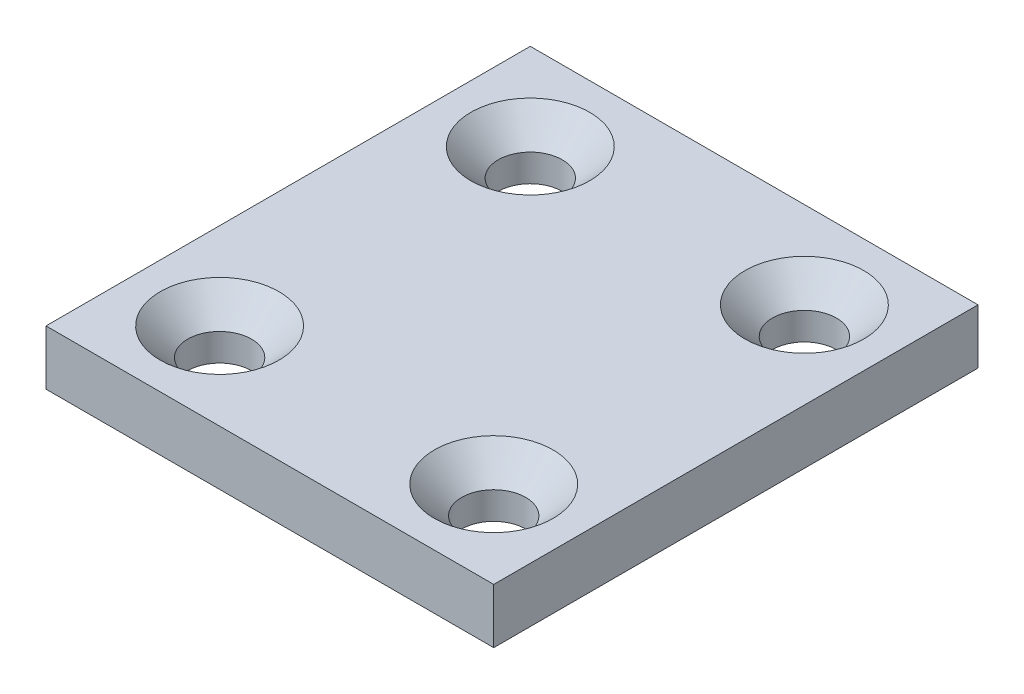
ISO-10303-21;
HEADER;
FILE_DESCRIPTION(('STEP AP214'),'2;1');
FILE_NAME('part.step','',(''),(''),'','','');
FILE_SCHEMA(('AUTOMOTIVE_DESIGN { 1 0 10303 214 1 1 1 1 }'));
ENDSEC;
DATA;
#1=APPLICATION_CONTEXT('core data for automotive mechanical design processes');
#2=APPLICATION_PROTOCOL_DEFINITION('international standard','automotive_design',2000,#1);
#3=PRODUCT_CONTEXT('',#1,'mechanical');
#4=PRODUCT('Part','Part','',(#3));
#5=PRODUCT_RELATED_PRODUCT_CATEGORY('part','',(#4));
#6=PRODUCT_DEFINITION_FORMATION('','',#4);
#7=PRODUCT_DEFINITION_CONTEXT('part definition',#1,'design');
#8=PRODUCT_DEFINITION('design','',#6,#7);
#9=PRODUCT_DEFINITION_SHAPE('','',#8);
#10=(LENGTH_UNIT() NAMED_UNIT(*) SI_UNIT(.MILLI.,.METRE.));
#11=(NAMED_UNIT(*) PLANE_ANGLE_UNIT() SI_UNIT($,.RADIAN.));
#12=(NAMED_UNIT(*) SI_UNIT($,.STERADIAN.) SOLID_ANGLE_UNIT());
#13=UNCERTAINTY_MEASURE_WITH_UNIT(LENGTH_MEASURE(1.E-05),#10,'distance_accuracy_value','');
#14=(GEOMETRIC_REPRESENTATION_CONTEXT(3) GLOBAL_UNCERTAINTY_ASSIGNED_CONTEXT((#13)) GLOBAL_UNIT_ASSIGNED_CONTEXT((#10,
#11,#12)) REPRESENTATION_CONTEXT('',''));
#15=CARTESIAN_POINT('',(0.,0.,0.));
#16=DIRECTION('',(0.,0.,1.));
#17=DIRECTION('',(1.,0.,0.));
#18=AXIS2_PLACEMENT_3D('',#15,#16,#17);
#19=CARTESIAN_POINT('',(0.,3.,0.));
#20=DIRECTION('',(0.,-1.,0.));
#21=DIRECTION('',(0.,0.,-1.));
#22=AXIS2_PLACEMENT_3D('',#19,#20,#21);
#23=PLANE('',#22);
#24=CARTESIAN_POINT('',(0.,3.,0.));
#25=DIRECTION('',(0.,1.,0.));
#26=DIRECTION('',(0.,0.,1.));
#27=AXIS2_PLACEMENT_3D('',#24,#25,#26);
#28=CIRCLE('',#27,3.25);
#29=CARTESIAN_POINT('',(0.,3.,3.25));
#30=VERTEX_POINT('',#29);
#31=EDGE_CURVE('E154',#30,#30,#28,.T.);
#32=ORIENTED_EDGE('',*,*,#31,.F.);
#33=EDGE_LOOP('',(#32));
#34=FACE_BOUND('',#33,.T.);
#35=CARTESIAN_POINT('',(15.,3.,0.));
#36=DIRECTION('',(0.,1.,0.));
#37=DIRECTION('',(0.,0.,1.));
#38=AXIS2_PLACEMENT_3D('',#35,#36,#37);
#39=CIRCLE('',#38,3.25);
#40=CARTESIAN_POINT('',(15.,3.,3.25));
#41=VERTEX_POINT('',#40);
#42=EDGE_CURVE('E143',#41,#41,#39,.T.);
#43=ORIENTED_EDGE('',*,*,#42,.F.);
#44=EDGE_LOOP('',(#43));
#45=FACE_BOUND('',#44,.T.);
#46=CARTESIAN_POINT('',(0.,3.,-17.));
#47=DIRECTION('',(0.,1.,0.));
#48=DIRECTION('',(0.,0.,1.));
#49=AXIS2_PLACEMENT_3D('',#46,#47,#48);
#50=CIRCLE('',#49,3.25);
#51=CARTESIAN_POINT('',(0.,3.,-13.75));
#52=VERTEX_POINT('',#51);
#53=EDGE_CURVE('E136',#52,#52,#50,.T.);
#54=ORIENTED_EDGE('',*,*,#53,.F.);
#55=EDGE_LOOP('',(#54));
#56=FACE_BOUND('',#55,.T.);
#57=DIRECTION('',(0.,0.,1.));
#58=VECTOR('',#57,1.);
#59=CARTESIAN_POINT('',(-4.75,3.,4.75));
#60=LINE('',#59,#58);
#61=CARTESIAN_POINT('',(-4.75,3.,-21.75));
#62=VERTEX_POINT('',#61);
#63=CARTESIAN_POINT('',(-4.75,3.,4.75));
#64=VERTEX_POINT('',#63);
#65=EDGE_CURVE('E99',#62,#64,#60,.T.);
#66=ORIENTED_EDGE('',*,*,#65,.T.);
#67=DIRECTION('',(1.,0.,0.));
#68=VECTOR('',#67,1.);
#69=CARTESIAN_POINT('',(-4.75,3.,4.75));
#70=LINE('',#69,#68);
#71=CARTESIAN_POINT('',(19.75,3.,4.75));
#72=VERTEX_POINT('',#71);
#73=EDGE_CURVE('E92',#64,#72,#70,.T.);
#74=ORIENTED_EDGE('',*,*,#73,.T.);
#75=DIRECTION('',(0.,0.,-1.));
#76=VECTOR('',#75,1.);
#77=CARTESIAN_POINT('',(19.75,3.,4.75));
#78=LINE('',#77,#76);
#79=CARTESIAN_POINT('',(19.75,3.,-21.75));
#80=VERTEX_POINT('',#79);
#81=EDGE_CURVE('E98',#72,#80,#78,.T.);
#82=ORIENTED_EDGE('',*,*,#81,.T.);
#83=DIRECTION('',(-1.,0.,0.));
#84=VECTOR('',#83,1.);
#85=CARTESIAN_POINT('',(-4.75,3.,-21.75));
#86=LINE('',#85,#84);
#87=EDGE_CURVE('E63',#80,#62,#86,.T.);
#88=ORIENTED_EDGE('',*,*,#87,.T.);
#89=EDGE_LOOP('',(#66,#74,#82,#88));
#90=FACE_BOUND('',#89,.T.);
#91=CARTESIAN_POINT('',(15.,3.,-17.));
#92=DIRECTION('',(0.,1.,0.));
#93=DIRECTION('',(0.,0.,1.));
#94=AXIS2_PLACEMENT_3D('',#91,#92,#93);
#95=CIRCLE('',#94,3.25);
#96=CARTESIAN_POINT('',(15.,3.,-13.75));
#97=VERTEX_POINT('',#96);
#98=EDGE_CURVE('E139',#97,#97,#95,.T.);
#99=ORIENTED_EDGE('',*,*,#98,.F.);
#100=EDGE_LOOP('',(#99));
#101=FACE_BOUND('',#100,.T.);
#102=ADVANCED_FACE('F44',(#34,#45,#56,#90,#101),#23,.F.);
#103=CARTESIAN_POINT('',(0.,0.,0.));
#104=DIRECTION('',(0.,-1.,0.));
#105=DIRECTION('',(0.,0.,-1.));
#106=AXIS2_PLACEMENT_3D('',#103,#104,#105);
#107=PLANE('',#106);
#108=CARTESIAN_POINT('',(0.,0.,-17.));
#109=DIRECTION('',(0.,1.,0.));
#110=DIRECTION('',(0.,0.,1.));
#111=AXIS2_PLACEMENT_3D('',#108,#109,#110);
#112=CIRCLE('',#111,1.75);
#113=CARTESIAN_POINT('',(0.,0.,-15.25));
#114=VERTEX_POINT('',#113);
#115=EDGE_CURVE('E170',#114,#114,#112,.T.);
#116=ORIENTED_EDGE('',*,*,#115,.T.);
#117=EDGE_LOOP('',(#116));
#118=FACE_BOUND('',#117,.T.);
#119=CARTESIAN_POINT('',(0.,0.,0.));
#120=DIRECTION('',(0.,1.,0.));
#121=DIRECTION('',(0.,0.,1.));
#122=AXIS2_PLACEMENT_3D('',#119,#120,#121);
#123=CIRCLE('',#122,1.75);
#124=CARTESIAN_POINT('',(0.,0.,1.75));
#125=VERTEX_POINT('',#124);
#126=EDGE_CURVE('E121',#125,#125,#123,.T.);
#127=ORIENTED_EDGE('',*,*,#126,.T.);
#128=EDGE_LOOP('',(#127));
#129=FACE_BOUND('',#128,.T.);
#130=DIRECTION('',(0.,0.,1.));
#131=VECTOR('',#130,1.);
#132=CARTESIAN_POINT('',(-4.75,0.,4.75));
#133=LINE('',#132,#131);
#134=CARTESIAN_POINT('',(-4.75,0.,-21.75));
#135=VERTEX_POINT('',#134);
#136=CARTESIAN_POINT('',(-4.75,0.,4.75));
#137=VERTEX_POINT('',#136);
#138=EDGE_CURVE('E120',#135,#137,#133,.T.);
#139=ORIENTED_EDGE('',*,*,#138,.F.);
#140=DIRECTION('',(-1.,0.,0.));
#141=VECTOR('',#140,1.);
#142=CARTESIAN_POINT('',(-4.75,0.,-21.75));
#143=LINE('',#142,#141);
#144=CARTESIAN_POINT('',(19.75,0.,-21.75));
#145=VERTEX_POINT('',#144);
#146=EDGE_CURVE('E86',#145,#135,#143,.T.);
#147=ORIENTED_EDGE('',*,*,#146,.F.);
#148=DIRECTION('',(0.,0.,-1.));
#149=VECTOR('',#148,1.);
#150=CARTESIAN_POINT('',(19.75,0.,4.75));
#151=LINE('',#150,#149);
#152=CARTESIAN_POINT('',(19.75,0.,4.75));
#153=VERTEX_POINT('',#152);
#154=EDGE_CURVE('E85',#153,#145,#151,.T.);
#155=ORIENTED_EDGE('',*,*,#154,.F.);
#156=DIRECTION('',(1.,0.,0.));
#157=VECTOR('',#156,1.);
#158=CARTESIAN_POINT('',(-4.75,0.,4.75));
#159=LINE('',#158,#157);
#160=EDGE_CURVE('E104',#137,#153,#159,.T.);
#161=ORIENTED_EDGE('',*,*,#160,.F.);
#162=EDGE_LOOP('',(#139,#147,#155,#161));
#163=FACE_BOUND('',#162,.T.);
#164=CARTESIAN_POINT('',(15.,0.,0.));
#165=DIRECTION('',(0.,1.,0.));
#166=DIRECTION('',(0.,0.,1.));
#167=AXIS2_PLACEMENT_3D('',#164,#165,#166);
#168=CIRCLE('',#167,1.75);
#169=CARTESIAN_POINT('',(15.,0.,1.75));
#170=VERTEX_POINT('',#169);
#171=EDGE_CURVE('E172',#170,#170,#168,.T.);
#172=ORIENTED_EDGE('',*,*,#171,.T.);
#173=EDGE_LOOP('',(#172));
#174=FACE_BOUND('',#173,.T.);
#175=CARTESIAN_POINT('',(15.,0.,-17.));
#176=DIRECTION('',(0.,1.,0.));
#177=DIRECTION('',(0.,0.,1.));
#178=AXIS2_PLACEMENT_3D('',#175,#176,#177);
#179=CIRCLE('',#178,1.75);
#180=CARTESIAN_POINT('',(15.,0.,-15.25));
#181=VERTEX_POINT('',#180);
#182=EDGE_CURVE('E133',#181,#181,#179,.T.);
#183=ORIENTED_EDGE('',*,*,#182,.T.);
#184=EDGE_LOOP('',(#183));
#185=FACE_BOUND('',#184,.T.);
#186=ADVANCED_FACE('F179',(#118,#129,#163,#174,#185),#107,.T.);
#187=CARTESIAN_POINT('',(-4.75,3.,4.75));
#188=DIRECTION('',(1.,0.,0.));
#189=DIRECTION('',(0.,0.,-1.));
#190=AXIS2_PLACEMENT_3D('',#187,#188,#189);
#191=PLANE('',#190);
#192=ORIENTED_EDGE('',*,*,#138,.T.);
#193=DIRECTION('',(0.,-1.,0.));
#194=VECTOR('',#193,1.);
#195=CARTESIAN_POINT('',(-4.75,3.,4.75));
#196=LINE('',#195,#194);
#197=EDGE_CURVE('E11',#64,#137,#196,.T.);
#198=ORIENTED_EDGE('',*,*,#197,.F.);
#199=ORIENTED_EDGE('',*,*,#65,.F.);
#200=DIRECTION('',(0.,-1.,0.));
#201=VECTOR('',#200,1.);
#202=CARTESIAN_POINT('',(-4.75,3.,-21.75));
#203=LINE('',#202,#201);
#204=EDGE_CURVE('E114',#62,#135,#203,.T.);
#205=ORIENTED_EDGE('',*,*,#204,.T.);
#206=EDGE_LOOP('',(#192,#198,#199,#205));
#207=FACE_BOUND('',#206,.T.);
#208=ADVANCED_FACE('F50',(#207),#191,.F.);
#209=CARTESIAN_POINT('',(-4.75,3.,4.75));
#210=DIRECTION('',(0.,0.,-1.));
#211=DIRECTION('',(-1.,0.,0.));
#212=AXIS2_PLACEMENT_3D('',#209,#210,#211);
#213=PLANE('',#212);
#214=ORIENTED_EDGE('',*,*,#160,.T.);
#215=DIRECTION('',(0.,-1.,0.));
#216=VECTOR('',#215,1.);
#217=CARTESIAN_POINT('',(19.75,3.,4.75));
#218=LINE('',#217,#216);
#219=EDGE_CURVE('E57',#72,#153,#218,.T.);
#220=ORIENTED_EDGE('',*,*,#219,.F.);
#221=ORIENTED_EDGE('',*,*,#73,.F.);
#222=ORIENTED_EDGE('',*,*,#197,.T.);
#223=EDGE_LOOP('',(#214,#220,#221,#222));
#224=FACE_BOUND('',#223,.T.);
#225=ADVANCED_FACE('F102',(#224),#213,.F.);
#226=CARTESIAN_POINT('',(19.75,3.,4.75));
#227=DIRECTION('',(-1.,0.,0.));
#228=DIRECTION('',(0.,0.,1.));
#229=AXIS2_PLACEMENT_3D('',#226,#227,#228);
#230=PLANE('',#229);
#231=ORIENTED_EDGE('',*,*,#154,.T.);
#232=DIRECTION('',(0.,-1.,0.));
#233=VECTOR('',#232,1.);
#234=CARTESIAN_POINT('',(19.75,3.,-21.75));
#235=LINE('',#234,#233);
#236=EDGE_CURVE('E110',#80,#145,#235,.T.);
#237=ORIENTED_EDGE('',*,*,#236,.F.);
#238=ORIENTED_EDGE('',*,*,#81,.F.);
#239=ORIENTED_EDGE('',*,*,#219,.T.);
#240=EDGE_LOOP('',(#231,#237,#238,#239));
#241=FACE_BOUND('',#240,.T.);
#242=ADVANCED_FACE('F108',(#241),#230,.F.);
#243=CARTESIAN_POINT('',(-4.75,3.,-21.75));
#244=DIRECTION('',(0.,0.,1.));
#245=DIRECTION('',(1.,0.,0.));
#246=AXIS2_PLACEMENT_3D('',#243,#244,#245);
#247=PLANE('',#246);
#248=ORIENTED_EDGE('',*,*,#146,.T.);
#249=ORIENTED_EDGE('',*,*,#204,.F.);
#250=ORIENTED_EDGE('',*,*,#87,.F.);
#251=ORIENTED_EDGE('',*,*,#236,.T.);
#252=EDGE_LOOP('',(#248,#249,#250,#251));
#253=FACE_BOUND('',#252,.T.);
#254=ADVANCED_FACE('F187',(#253),#247,.F.);
#255=CARTESIAN_POINT('',(0.,3.,0.));
#256=DIRECTION('',(0.,-1.,0.));
#257=DIRECTION('',(0.,0.,-1.));
#258=AXIS2_PLACEMENT_3D('',#255,#256,#257);
#259=CYLINDRICAL_SURFACE('',#258,1.75);
#260=CARTESIAN_POINT('',(0.,1.5,0.));
#261=DIRECTION('',(0.,1.,0.));
#262=DIRECTION('',(0.,0.,1.));
#263=AXIS2_PLACEMENT_3D('',#260,#261,#262);
#264=CIRCLE('',#263,1.75);
#265=CARTESIAN_POINT('',(0.,1.5,1.75));
#266=VERTEX_POINT('',#265);
#267=EDGE_CURVE('E47',#266,#266,#264,.F.);
#268=ORIENTED_EDGE('',*,*,#267,.F.);
#269=EDGE_LOOP('',(#268));
#270=FACE_BOUND('',#269,.T.);
#271=ORIENTED_EDGE('',*,*,#126,.F.);
#272=EDGE_LOOP('',(#271));
#273=FACE_BOUND('',#272,.T.);
#274=ADVANCED_FACE('F181',(#270,#273),#259,.F.);
#275=CARTESIAN_POINT('',(15.,3.,0.));
#276=DIRECTION('',(0.,-1.,0.));
#277=DIRECTION('',(0.,0.,-1.));
#278=AXIS2_PLACEMENT_3D('',#275,#276,#277);
#279=CYLINDRICAL_SURFACE('',#278,1.75);
#280=CARTESIAN_POINT('',(15.,1.5,0.));
#281=DIRECTION('',(0.,1.,0.));
#282=DIRECTION('',(0.,0.,1.));
#283=AXIS2_PLACEMENT_3D('',#280,#281,#282);
#284=CIRCLE('',#283,1.75);
#285=CARTESIAN_POINT('',(15.,1.5,1.75));
#286=VERTEX_POINT('',#285);
#287=EDGE_CURVE('E140',#286,#286,#284,.F.);
#288=ORIENTED_EDGE('',*,*,#287,.F.);
#289=EDGE_LOOP('',(#288));
#290=FACE_BOUND('',#289,.T.);
#291=ORIENTED_EDGE('',*,*,#171,.F.);
#292=EDGE_LOOP('',(#291));
#293=FACE_BOUND('',#292,.T.);
#294=ADVANCED_FACE('F183',(#290,#293),#279,.F.);
#295=CARTESIAN_POINT('',(0.,3.,-17.));
#296=DIRECTION('',(0.,-1.,0.));
#297=DIRECTION('',(0.,0.,-1.));
#298=AXIS2_PLACEMENT_3D('',#295,#296,#297);
#299=CYLINDRICAL_SURFACE('',#298,1.75);
#300=CARTESIAN_POINT('',(0.,1.5,-17.));
#301=DIRECTION('',(0.,1.,0.));
#302=DIRECTION('',(0.,0.,1.));
#303=AXIS2_PLACEMENT_3D('',#300,#301,#302);
#304=CIRCLE('',#303,1.75);
#305=CARTESIAN_POINT('',(0.,1.5,-15.25));
#306=VERTEX_POINT('',#305);
#307=EDGE_CURVE('E135',#306,#306,#304,.F.);
#308=ORIENTED_EDGE('',*,*,#307,.F.);
#309=EDGE_LOOP('',(#308));
#310=FACE_BOUND('',#309,.T.);
#311=ORIENTED_EDGE('',*,*,#115,.F.);
#312=EDGE_LOOP('',(#311));
#313=FACE_BOUND('',#312,.T.);
#314=ADVANCED_FACE('F192',(#310,#313),#299,.F.);
#315=CARTESIAN_POINT('',(15.,3.,-17.));
#316=DIRECTION('',(0.,-1.,0.));
#317=DIRECTION('',(0.,0.,-1.));
#318=AXIS2_PLACEMENT_3D('',#315,#316,#317);
#319=CYLINDRICAL_SURFACE('',#318,1.75);
#320=CARTESIAN_POINT('',(15.,1.5,-17.));
#321=DIRECTION('',(0.,1.,0.));
#322=DIRECTION('',(0.,0.,1.));
#323=AXIS2_PLACEMENT_3D('',#320,#321,#322);
#324=CIRCLE('',#323,1.75);
#325=CARTESIAN_POINT('',(15.,1.5,-15.25));
#326=VERTEX_POINT('',#325);
#327=EDGE_CURVE('E150',#326,#326,#324,.F.);
#328=ORIENTED_EDGE('',*,*,#327,.F.);
#329=EDGE_LOOP('',(#328));
#330=FACE_BOUND('',#329,.T.);
#331=ORIENTED_EDGE('',*,*,#182,.F.);
#332=EDGE_LOOP('',(#331));
#333=FACE_BOUND('',#332,.T.);
#334=ADVANCED_FACE('F224',(#330,#333),#319,.F.);
#335=CARTESIAN_POINT('',(0.,3.,-17.));
#336=DIRECTION('',(0.,1.,0.));
#337=DIRECTION('',(0.,0.,1.));
#338=AXIS2_PLACEMENT_3D('',#335,#336,#337);
#339=CONICAL_SURFACE('',#338,3.25,0.785398163397448);
#340=ORIENTED_EDGE('',*,*,#307,.T.);
#341=EDGE_LOOP('',(#340));
#342=FACE_BOUND('',#341,.T.);
#343=ORIENTED_EDGE('',*,*,#53,.T.);
#344=EDGE_LOOP('',(#343));
#345=FACE_BOUND('',#344,.T.);
#346=ADVANCED_FACE('F223',(#342,#345),#339,.F.);
#347=CARTESIAN_POINT('',(15.,3.,-17.));
#348=DIRECTION('',(0.,1.,0.));
#349=DIRECTION('',(0.,0.,1.));
#350=AXIS2_PLACEMENT_3D('',#347,#348,#349);
#351=CONICAL_SURFACE('',#350,3.25,0.785398163397449);
#352=ORIENTED_EDGE('',*,*,#327,.T.);
#353=EDGE_LOOP('',(#352));
#354=FACE_BOUND('',#353,.T.);
#355=ORIENTED_EDGE('',*,*,#98,.T.);
#356=EDGE_LOOP('',(#355));
#357=FACE_BOUND('',#356,.T.);
#358=ADVANCED_FACE('F235',(#354,#357),#351,.F.);
#359=CARTESIAN_POINT('',(15.,3.,0.));
#360=DIRECTION('',(0.,1.,0.));
#361=DIRECTION('',(0.,0.,1.));
#362=AXIS2_PLACEMENT_3D('',#359,#360,#361);
#363=CONICAL_SURFACE('',#362,3.25,0.785398163397449);
#364=ORIENTED_EDGE('',*,*,#287,.T.);
#365=EDGE_LOOP('',(#364));
#366=FACE_BOUND('',#365,.T.);
#367=ORIENTED_EDGE('',*,*,#42,.T.);
#368=EDGE_LOOP('',(#367));
#369=FACE_BOUND('',#368,.T.);
#370=ADVANCED_FACE('F242',(#366,#369),#363,.F.);
#371=CARTESIAN_POINT('',(0.,3.,0.));
#372=DIRECTION('',(0.,1.,0.));
#373=DIRECTION('',(0.,0.,1.));
#374=AXIS2_PLACEMENT_3D('',#371,#372,#373);
#375=CONICAL_SURFACE('',#374,3.25,0.785398163397448);
#376=ORIENTED_EDGE('',*,*,#267,.T.);
#377=EDGE_LOOP('',(#376));
#378=FACE_BOUND('',#377,.T.);
#379=ORIENTED_EDGE('',*,*,#31,.T.);
#380=EDGE_LOOP('',(#379));
#381=FACE_BOUND('',#380,.T.);
#382=ADVANCED_FACE('F243',(#378,#381),#375,.F.);
#383=CLOSED_SHELL('',(#102,#186,#208,#225,#242,#254,#274,#294,#314,#334,#346,#358,#370,#382));
#384=MANIFOLD_SOLID_BREP('B2',#383);
#385=ADVANCED_BREP_SHAPE_REPRESENTATION('',(#18,#384),#14);
#386=SHAPE_DEFINITION_REPRESENTATION(#9,#385);
ENDSEC;
END-ISO-10303-21;
